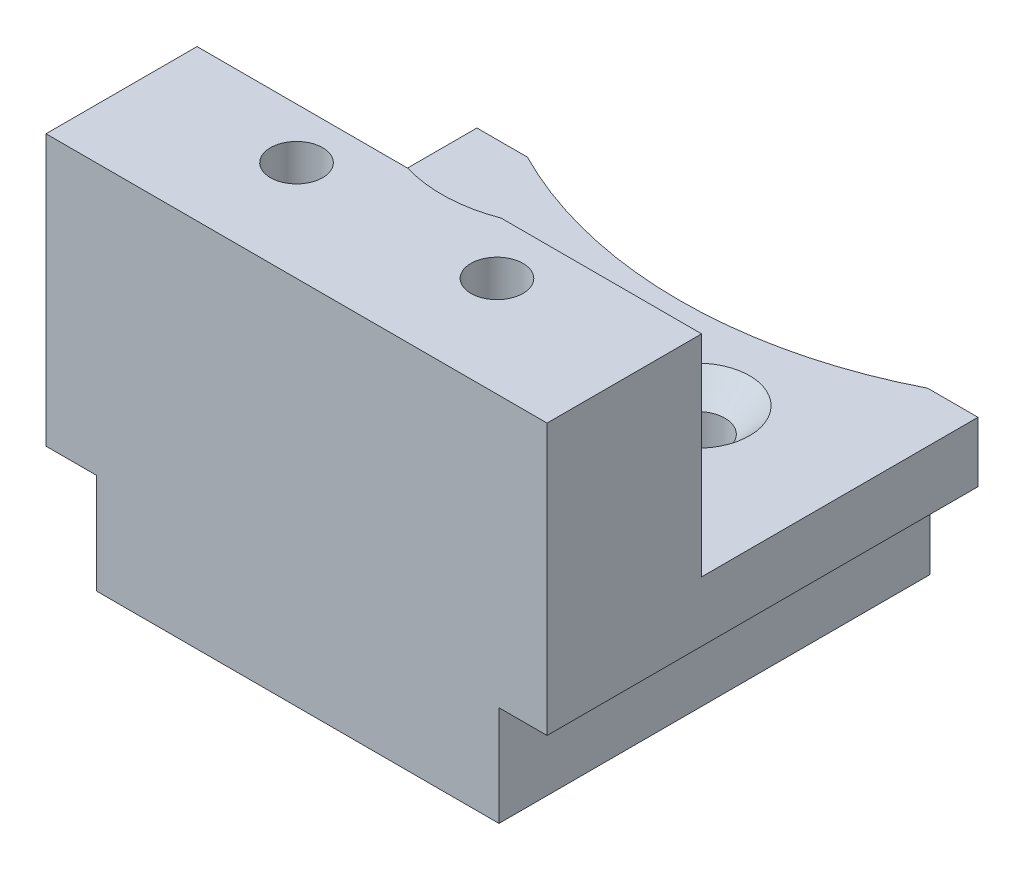
ISO-10303-21;
HEADER;
FILE_DESCRIPTION(('STEP AP214'),'2;1');
FILE_NAME('part.step','',(''),(''),'','','');
FILE_SCHEMA(('AUTOMOTIVE_DESIGN { 1 0 10303 214 1 1 1 1 }'));
ENDSEC;
DATA;
#1=APPLICATION_CONTEXT('core data for automotive mechanical design processes');
#2=APPLICATION_PROTOCOL_DEFINITION('international standard','automotive_design',2000,#1);
#3=PRODUCT_CONTEXT('',#1,'mechanical');
#4=PRODUCT('Part','Part','',(#3));
#5=PRODUCT_RELATED_PRODUCT_CATEGORY('part','',(#4));
#6=PRODUCT_DEFINITION_FORMATION('','',#4);
#7=PRODUCT_DEFINITION_CONTEXT('part definition',#1,'design');
#8=PRODUCT_DEFINITION('design','',#6,#7);
#9=PRODUCT_DEFINITION_SHAPE('','',#8);
#10=(LENGTH_UNIT() NAMED_UNIT(*) SI_UNIT(.MILLI.,.METRE.));
#11=(NAMED_UNIT(*) PLANE_ANGLE_UNIT() SI_UNIT($,.RADIAN.));
#12=(NAMED_UNIT(*) SI_UNIT($,.STERADIAN.) SOLID_ANGLE_UNIT());
#13=UNCERTAINTY_MEASURE_WITH_UNIT(LENGTH_MEASURE(1.E-05),#10,'distance_accuracy_value','');
#14=(GEOMETRIC_REPRESENTATION_CONTEXT(3) GLOBAL_UNCERTAINTY_ASSIGNED_CONTEXT((#13)) GLOBAL_UNIT_ASSIGNED_CONTEXT((#10,
#11,#12)) REPRESENTATION_CONTEXT('',''));
#15=CARTESIAN_POINT('',(0.,0.,0.));
#16=DIRECTION('',(0.,0.,1.));
#17=DIRECTION('',(1.,0.,0.));
#18=AXIS2_PLACEMENT_3D('',#15,#16,#17);
#19=CARTESIAN_POINT('',(0.,6.,3.00000000000003));
#20=DIRECTION('',(0.,0.,-1.));
#21=DIRECTION('',(-1.,0.,0.));
#22=AXIS2_PLACEMENT_3D('',#19,#20,#21);
#23=PLANE('',#22);
#24=DIRECTION('',(1.,0.,0.));
#25=VECTOR('',#24,1.);
#26=CARTESIAN_POINT('',(50.,0.,3.));
#27=LINE('',#26,#25);
#28=CARTESIAN_POINT('',(45.2,0.,3.));
#29=VERTEX_POINT('',#28);
#30=CARTESIAN_POINT('',(50.,0.,3.));
#31=VERTEX_POINT('',#30);
#32=EDGE_CURVE('E153',#29,#31,#27,.T.);
#33=ORIENTED_EDGE('',*,*,#32,.F.);
#34=DIRECTION('',(0.,1.,0.));
#35=VECTOR('',#34,1.);
#36=CARTESIAN_POINT('',(45.2,0.,3.));
#37=LINE('',#36,#35);
#38=CARTESIAN_POINT('',(45.2,-10.,3.));
#39=VERTEX_POINT('',#38);
#40=EDGE_CURVE('E143',#39,#29,#37,.T.);
#41=ORIENTED_EDGE('',*,*,#40,.F.);
#42=DIRECTION('',(-1.,0.,0.));
#43=VECTOR('',#42,1.);
#44=CARTESIAN_POINT('',(50.,-10.,3.));
#45=LINE('',#44,#43);
#46=CARTESIAN_POINT('',(5.03118440875324,-10.,3.00000000000001));
#47=VERTEX_POINT('',#46);
#48=EDGE_CURVE('E151',#39,#47,#45,.T.);
#49=ORIENTED_EDGE('',*,*,#48,.T.);
#50=DIRECTION('',(0.,-1.,0.));
#51=VECTOR('',#50,1.);
#52=CARTESIAN_POINT('',(5.03118440875324,0.,3.00000000000002));
#53=LINE('',#52,#51);
#54=CARTESIAN_POINT('',(5.03118440875324,0.,3.00000000000002));
#55=VERTEX_POINT('',#54);
#56=EDGE_CURVE('E67',#55,#47,#53,.T.);
#57=ORIENTED_EDGE('',*,*,#56,.F.);
#58=DIRECTION('',(-1.,0.,0.));
#59=VECTOR('',#58,1.);
#60=CARTESIAN_POINT('',(50.,0.,2.99999999999999));
#61=LINE('',#60,#59);
#62=CARTESIAN_POINT('',(44.9688155912468,0.,2.99999999999999));
#63=VERTEX_POINT('',#62);
#64=EDGE_CURVE('E161',#63,#55,#61,.T.);
#65=ORIENTED_EDGE('',*,*,#64,.F.);
#66=DIRECTION('',(0.,-1.,0.));
#67=VECTOR('',#66,1.);
#68=CARTESIAN_POINT('',(44.9688155912468,6.,3.));
#69=LINE('',#68,#67);
#70=CARTESIAN_POINT('',(44.9688155912468,6.,3.));
#71=VERTEX_POINT('',#70);
#72=EDGE_CURVE('E285',#71,#63,#69,.T.);
#73=ORIENTED_EDGE('',*,*,#72,.F.);
#74=DIRECTION('',(1.,0.,0.));
#75=VECTOR('',#74,1.);
#76=CARTESIAN_POINT('',(0.,6.,3.00000000000003));
#77=LINE('',#76,#75);
#78=CARTESIAN_POINT('',(50.,6.,3.));
#79=VERTEX_POINT('',#78);
#80=EDGE_CURVE('E281',#71,#79,#77,.T.);
#81=ORIENTED_EDGE('',*,*,#80,.T.);
#82=DIRECTION('',(0.,-1.,0.));
#83=VECTOR('',#82,1.);
#84=CARTESIAN_POINT('',(50.,6.,3.));
#85=LINE('',#84,#83);
#86=EDGE_CURVE('E298',#79,#31,#85,.T.);
#87=ORIENTED_EDGE('',*,*,#86,.T.);
#88=EDGE_LOOP('',(#33,#41,#49,#57,#65,#73,#81,#87));
#89=FACE_BOUND('',#88,.T.);
#90=ADVANCED_FACE('F44',(#89),#23,.T.);
#91=CARTESIAN_POINT('',(0.,6.,0.));
#92=DIRECTION('',(0.,1.,0.));
#93=DIRECTION('',(0.,0.,1.));
#94=AXIS2_PLACEMENT_3D('',#91,#92,#93);
#95=PLANE('',#94);
#96=CARTESIAN_POINT('',(25.,6.,17.5));
#97=DIRECTION('',(0.,1.,0.));
#98=DIRECTION('',(0.,0.,1.));
#99=AXIS2_PLACEMENT_3D('',#96,#97,#98);
#100=CIRCLE('',#99,3.25);
#101=CARTESIAN_POINT('',(25.,6.,20.75));
#102=VERTEX_POINT('',#101);
#103=EDGE_CURVE('E251',#102,#102,#100,.T.);
#104=ORIENTED_EDGE('',*,*,#103,.F.);
#105=EDGE_LOOP('',(#104));
#106=FACE_BOUND('',#105,.T.);
#107=CARTESIAN_POINT('',(35.,6.,16.));
#108=DIRECTION('',(0.,1.,0.));
#109=DIRECTION('',(0.,0.,1.));
#110=AXIS2_PLACEMENT_3D('',#107,#108,#109);
#111=CIRCLE('',#110,5.2);
#112=CARTESIAN_POINT('',(35.,6.,21.2));
#113=VERTEX_POINT('',#112);
#114=EDGE_CURVE('E235',#113,#113,#111,.T.);
#115=ORIENTED_EDGE('',*,*,#114,.F.);
#116=EDGE_LOOP('',(#115));
#117=FACE_BOUND('',#116,.T.);
#118=CARTESIAN_POINT('',(15.,6.,16.));
#119=DIRECTION('',(0.,1.,0.));
#120=DIRECTION('',(0.,0.,1.));
#121=AXIS2_PLACEMENT_3D('',#118,#119,#120);
#122=CIRCLE('',#121,5.2);
#123=CARTESIAN_POINT('',(15.,6.,21.2));
#124=VERTEX_POINT('',#123);
#125=EDGE_CURVE('E223',#124,#124,#122,.T.);
#126=ORIENTED_EDGE('',*,*,#125,.F.);
#127=EDGE_LOOP('',(#126));
#128=FACE_BOUND('',#127,.T.);
#129=CARTESIAN_POINT('',(25.,6.,17.5));
#130=DIRECTION('',(0.,-1.,0.));
#131=DIRECTION('',(0.,0.,1.));
#132=AXIS2_PLACEMENT_3D('',#129,#130,#131);
#133=CIRCLE('',#132,14.);
#134=CARTESIAN_POINT('',(29.9890512919729,6.,30.5808779218393));
#135=VERTEX_POINT('',#134);
#136=CARTESIAN_POINT('',(21.0399484474264,6.,30.9282534866214));
#137=VERTEX_POINT('',#136);
#138=EDGE_CURVE('E204',#135,#137,#133,.T.);
#139=ORIENTED_EDGE('',*,*,#138,.F.);
#140=DIRECTION('',(-1.,0.,0.));
#141=VECTOR('',#140,1.);
#142=CARTESIAN_POINT('',(50.,6.,30.5808779218393));
#143=LINE('',#142,#141);
#144=CARTESIAN_POINT('',(50.,6.,30.5808779218393));
#145=VERTEX_POINT('',#144);
#146=EDGE_CURVE('E179',#145,#135,#143,.T.);
#147=ORIENTED_EDGE('',*,*,#146,.F.);
#148=DIRECTION('',(0.,0.,1.));
#149=VECTOR('',#148,1.);
#150=CARTESIAN_POINT('',(50.,6.,0.));
#151=LINE('',#150,#149);
#152=EDGE_CURVE('E277',#79,#145,#151,.T.);
#153=ORIENTED_EDGE('',*,*,#152,.F.);
#154=ORIENTED_EDGE('',*,*,#80,.F.);
#155=CARTESIAN_POINT('',(25.,6.,-36.2077339804633));
#156=DIRECTION('',(0.,1.,0.));
#157=DIRECTION('',(0.,0.,1.));
#158=AXIS2_PLACEMENT_3D('',#155,#156,#157);
#159=CIRCLE('',#158,44.);
#160=CARTESIAN_POINT('',(5.03118440875324,6.,3.));
#161=VERTEX_POINT('',#160);
#162=EDGE_CURVE('E264',#161,#71,#159,.T.);
#163=ORIENTED_EDGE('',*,*,#162,.F.);
#164=DIRECTION('',(1.,0.,0.));
#165=VECTOR('',#164,1.);
#166=CARTESIAN_POINT('',(0.,6.,3.));
#167=LINE('',#166,#165);
#168=CARTESIAN_POINT('',(0.,6.,3.));
#169=VERTEX_POINT('',#168);
#170=EDGE_CURVE('E268',#169,#161,#167,.T.);
#171=ORIENTED_EDGE('',*,*,#170,.F.);
#172=DIRECTION('',(0.,0.,1.));
#173=VECTOR('',#172,1.);
#174=CARTESIAN_POINT('',(0.,6.,0.));
#175=LINE('',#174,#173);
#176=CARTESIAN_POINT('',(0.,6.,30.9282534866214));
#177=VERTEX_POINT('',#176);
#178=EDGE_CURVE('E273',#169,#177,#175,.T.);
#179=ORIENTED_EDGE('',*,*,#178,.T.);
#180=DIRECTION('',(-1.,0.,0.));
#181=VECTOR('',#180,1.);
#182=CARTESIAN_POINT('',(21.0399484474264,6.,30.9282534866214));
#183=LINE('',#182,#181);
#184=EDGE_CURVE('E185',#137,#177,#183,.T.);
#185=ORIENTED_EDGE('',*,*,#184,.F.);
#186=EDGE_LOOP('',(#139,#147,#153,#154,#163,#171,#179,#185));
#187=FACE_BOUND('',#186,.T.);
#188=ADVANCED_FACE('F390',(#106,#117,#128,#187),#95,.T.);
#189=CARTESIAN_POINT('',(25.,6.,-36.2077339804633));
#190=DIRECTION('',(0.,-1.,0.));
#191=DIRECTION('',(0.,0.,-1.));
#192=AXIS2_PLACEMENT_3D('',#189,#190,#191);
#193=CYLINDRICAL_SURFACE('',#192,44.);
#194=CARTESIAN_POINT('',(25.,0.,-36.2077339804633));
#195=DIRECTION('',(0.,1.,0.));
#196=DIRECTION('',(0.,0.,1.));
#197=AXIS2_PLACEMENT_3D('',#194,#195,#196);
#198=CIRCLE('',#197,44.);
#199=EDGE_CURVE('E260',#55,#63,#198,.T.);
#200=ORIENTED_EDGE('',*,*,#199,.F.);
#201=DIRECTION('',(0.,-1.,0.));
#202=VECTOR('',#201,1.);
#203=CARTESIAN_POINT('',(5.03118440875324,6.,3.));
#204=LINE('',#203,#202);
#205=EDGE_CURVE('E255',#161,#55,#204,.T.);
#206=ORIENTED_EDGE('',*,*,#205,.F.);
#207=ORIENTED_EDGE('',*,*,#162,.T.);
#208=ORIENTED_EDGE('',*,*,#72,.T.);
#209=EDGE_LOOP('',(#200,#206,#207,#208));
#210=FACE_BOUND('',#209,.T.);
#211=ADVANCED_FACE('F46',(#210),#193,.F.);
#212=CARTESIAN_POINT('',(0.,6.,0.));
#213=DIRECTION('',(1.,0.,0.));
#214=DIRECTION('',(0.,0.,-1.));
#215=AXIS2_PLACEMENT_3D('',#212,#213,#214);
#216=PLANE('',#215);
#217=DIRECTION('',(0.,-1.,0.));
#218=VECTOR('',#217,1.);
#219=CARTESIAN_POINT('',(0.,6.,3.));
#220=LINE('',#219,#218);
#221=CARTESIAN_POINT('',(0.,0.,3.00000000000003));
#222=VERTEX_POINT('',#221);
#223=EDGE_CURVE('E309',#169,#222,#220,.T.);
#224=ORIENTED_EDGE('',*,*,#223,.T.);
#225=DIRECTION('',(0.,0.,-1.));
#226=VECTOR('',#225,1.);
#227=CARTESIAN_POINT('',(0.,0.,53.));
#228=LINE('',#227,#226);
#229=CARTESIAN_POINT('',(0.,0.,46.));
#230=VERTEX_POINT('',#229);
#231=EDGE_CURVE('E326',#230,#222,#228,.T.);
#232=ORIENTED_EDGE('',*,*,#231,.F.);
#233=DIRECTION('',(0.,-1.,0.));
#234=VECTOR('',#233,1.);
#235=CARTESIAN_POINT('',(0.,6.,46.));
#236=LINE('',#235,#234);
#237=CARTESIAN_POINT('',(0.,27.,46.));
#238=VERTEX_POINT('',#237);
#239=EDGE_CURVE('E305',#238,#230,#236,.T.);
#240=ORIENTED_EDGE('',*,*,#239,.F.);
#241=DIRECTION('',(0.,0.,1.));
#242=VECTOR('',#241,1.);
#243=CARTESIAN_POINT('',(0.,27.,30.9282534866214));
#244=LINE('',#243,#242);
#245=CARTESIAN_POINT('',(0.,27.,30.9282534866214));
#246=VERTEX_POINT('',#245);
#247=EDGE_CURVE('E180',#246,#238,#244,.T.);
#248=ORIENTED_EDGE('',*,*,#247,.F.);
#249=DIRECTION('',(0.,-1.,0.));
#250=VECTOR('',#249,1.);
#251=CARTESIAN_POINT('',(0.,27.,30.9282534866214));
#252=LINE('',#251,#250);
#253=EDGE_CURVE('E201',#246,#177,#252,.T.);
#254=ORIENTED_EDGE('',*,*,#253,.T.);
#255=ORIENTED_EDGE('',*,*,#178,.F.);
#256=EDGE_LOOP('',(#224,#232,#240,#248,#254,#255));
#257=FACE_BOUND('',#256,.T.);
#258=ADVANCED_FACE('F365',(#257),#216,.F.);
#259=CARTESIAN_POINT('',(0.,6.,46.));
#260=DIRECTION('',(0.,0.,-1.));
#261=DIRECTION('',(-1.,0.,0.));
#262=AXIS2_PLACEMENT_3D('',#259,#260,#261);
#263=PLANE('',#262);
#264=DIRECTION('',(0.,1.,0.));
#265=VECTOR('',#264,1.);
#266=CARTESIAN_POINT('',(45.2,6.,46.));
#267=LINE('',#266,#265);
#268=CARTESIAN_POINT('',(45.2,-10.,46.));
#269=VERTEX_POINT('',#268);
#270=CARTESIAN_POINT('',(45.2,0.,46.));
#271=VERTEX_POINT('',#270);
#272=EDGE_CURVE('E59',#269,#271,#267,.T.);
#273=ORIENTED_EDGE('',*,*,#272,.T.);
#274=DIRECTION('',(1.,0.,0.));
#275=VECTOR('',#274,1.);
#276=CARTESIAN_POINT('',(0.,0.,46.));
#277=LINE('',#276,#275);
#278=CARTESIAN_POINT('',(50.,0.,46.));
#279=VERTEX_POINT('',#278);
#280=EDGE_CURVE('E168',#271,#279,#277,.T.);
#281=ORIENTED_EDGE('',*,*,#280,.T.);
#282=DIRECTION('',(0.,-1.,0.));
#283=VECTOR('',#282,1.);
#284=CARTESIAN_POINT('',(50.,6.,46.));
#285=LINE('',#284,#283);
#286=CARTESIAN_POINT('',(50.,27.,46.));
#287=VERTEX_POINT('',#286);
#288=EDGE_CURVE('E301',#287,#279,#285,.T.);
#289=ORIENTED_EDGE('',*,*,#288,.F.);
#290=DIRECTION('',(1.,0.,0.));
#291=VECTOR('',#290,1.);
#292=CARTESIAN_POINT('',(0.,27.,46.));
#293=LINE('',#292,#291);
#294=EDGE_CURVE('E184',#238,#287,#293,.T.);
#295=ORIENTED_EDGE('',*,*,#294,.F.);
#296=ORIENTED_EDGE('',*,*,#239,.T.);
#297=DIRECTION('',(1.,0.,0.));
#298=VECTOR('',#297,1.);
#299=CARTESIAN_POINT('',(0.,0.,46.));
#300=LINE('',#299,#298);
#301=CARTESIAN_POINT('',(5.03118440875326,0.,46.));
#302=VERTEX_POINT('',#301);
#303=EDGE_CURVE('E343',#230,#302,#300,.T.);
#304=ORIENTED_EDGE('',*,*,#303,.T.);
#305=DIRECTION('',(0.,-1.,0.));
#306=VECTOR('',#305,1.);
#307=CARTESIAN_POINT('',(5.03118440875326,6.,46.));
#308=LINE('',#307,#306);
#309=CARTESIAN_POINT('',(5.03118440875326,-10.,46.));
#310=VERTEX_POINT('',#309);
#311=EDGE_CURVE('E336',#302,#310,#308,.T.);
#312=ORIENTED_EDGE('',*,*,#311,.T.);
#313=DIRECTION('',(-1.,0.,0.));
#314=VECTOR('',#313,1.);
#315=CARTESIAN_POINT('',(50.,-10.,46.));
#316=LINE('',#315,#314);
#317=EDGE_CURVE('E160',#269,#310,#316,.T.);
#318=ORIENTED_EDGE('',*,*,#317,.F.);
#319=EDGE_LOOP('',(#273,#281,#289,#295,#296,#304,#312,#318));
#320=FACE_BOUND('',#319,.T.);
#321=ADVANCED_FACE('F349',(#320),#263,.F.);
#322=CARTESIAN_POINT('',(50.,6.,0.));
#323=DIRECTION('',(1.,0.,0.));
#324=DIRECTION('',(0.,0.,-1.));
#325=AXIS2_PLACEMENT_3D('',#322,#323,#324);
#326=PLANE('',#325);
#327=DIRECTION('',(0.,0.,-1.));
#328=VECTOR('',#327,1.);
#329=CARTESIAN_POINT('',(50.,0.,53.));
#330=LINE('',#329,#328);
#331=EDGE_CURVE('E340',#279,#31,#330,.T.);
#332=ORIENTED_EDGE('',*,*,#331,.T.);
#333=ORIENTED_EDGE('',*,*,#86,.F.);
#334=ORIENTED_EDGE('',*,*,#152,.T.);
#335=DIRECTION('',(0.,-1.,0.));
#336=VECTOR('',#335,1.);
#337=CARTESIAN_POINT('',(50.,27.,30.5808779218393));
#338=LINE('',#337,#336);
#339=CARTESIAN_POINT('',(50.,27.,30.5808779218393));
#340=VERTEX_POINT('',#339);
#341=EDGE_CURVE('E220',#340,#145,#338,.T.);
#342=ORIENTED_EDGE('',*,*,#341,.F.);
#343=DIRECTION('',(0.,0.,-1.));
#344=VECTOR('',#343,1.);
#345=CARTESIAN_POINT('',(50.,27.,46.));
#346=LINE('',#345,#344);
#347=EDGE_CURVE('E189',#287,#340,#346,.T.);
#348=ORIENTED_EDGE('',*,*,#347,.F.);
#349=ORIENTED_EDGE('',*,*,#288,.T.);
#350=EDGE_LOOP('',(#332,#333,#334,#342,#348,#349));
#351=FACE_BOUND('',#350,.T.);
#352=ADVANCED_FACE('F355',(#351),#326,.T.);
#353=CARTESIAN_POINT('',(35.,6.,36.));
#354=DIRECTION('',(0.,-1.,0.));
#355=DIRECTION('',(0.,0.,-1.));
#356=AXIS2_PLACEMENT_3D('',#353,#354,#355);
#357=CYLINDRICAL_SURFACE('',#356,2.6);
#358=CARTESIAN_POINT('',(35.,0.,36.));
#359=DIRECTION('',(0.,1.,0.));
#360=DIRECTION('',(0.,0.,1.));
#361=AXIS2_PLACEMENT_3D('',#358,#359,#360);
#362=CIRCLE('',#361,2.6);
#363=CARTESIAN_POINT('',(35.,0.,38.6));
#364=VERTEX_POINT('',#363);
#365=EDGE_CURVE('E269',#364,#364,#362,.T.);
#366=ORIENTED_EDGE('',*,*,#365,.F.);
#367=EDGE_LOOP('',(#366));
#368=FACE_BOUND('',#367,.T.);
#369=CARTESIAN_POINT('',(35.,27.,36.));
#370=DIRECTION('',(0.,1.,0.));
#371=DIRECTION('',(0.,0.,1.));
#372=AXIS2_PLACEMENT_3D('',#369,#370,#371);
#373=CIRCLE('',#372,2.6);
#374=CARTESIAN_POINT('',(35.,27.,38.6));
#375=VERTEX_POINT('',#374);
#376=EDGE_CURVE('E165',#375,#375,#373,.T.);
#377=ORIENTED_EDGE('',*,*,#376,.T.);
#378=EDGE_LOOP('',(#377));
#379=FACE_BOUND('',#378,.T.);
#380=ADVANCED_FACE('F413',(#368,#379),#357,.F.);
#381=CARTESIAN_POINT('',(15.,6.,36.));
#382=DIRECTION('',(0.,-1.,0.));
#383=DIRECTION('',(0.,0.,-1.));
#384=AXIS2_PLACEMENT_3D('',#381,#382,#383);
#385=CYLINDRICAL_SURFACE('',#384,2.6);
#386=CARTESIAN_POINT('',(15.,0.,36.));
#387=DIRECTION('',(0.,1.,0.));
#388=DIRECTION('',(0.,0.,1.));
#389=AXIS2_PLACEMENT_3D('',#386,#387,#388);
#390=CIRCLE('',#389,2.6);
#391=CARTESIAN_POINT('',(15.,0.,38.6));
#392=VERTEX_POINT('',#391);
#393=EDGE_CURVE('E289',#392,#392,#390,.T.);
#394=ORIENTED_EDGE('',*,*,#393,.F.);
#395=EDGE_LOOP('',(#394));
#396=FACE_BOUND('',#395,.T.);
#397=CARTESIAN_POINT('',(15.,27.,36.));
#398=DIRECTION('',(0.,1.,0.));
#399=DIRECTION('',(0.,0.,1.));
#400=AXIS2_PLACEMENT_3D('',#397,#398,#399);
#401=CIRCLE('',#400,2.6);
#402=CARTESIAN_POINT('',(15.,27.,38.6));
#403=VERTEX_POINT('',#402);
#404=EDGE_CURVE('E175',#403,#403,#401,.T.);
#405=ORIENTED_EDGE('',*,*,#404,.T.);
#406=EDGE_LOOP('',(#405));
#407=FACE_BOUND('',#406,.T.);
#408=ADVANCED_FACE('F403',(#396,#407),#385,.F.);
#409=DIRECTION('',(1.,0.,0.));
#410=VECTOR('',#409,1.);
#411=CARTESIAN_POINT('',(0.,0.,3.00000000000003));
#412=LINE('',#411,#410);
#413=EDGE_CURVE('E155',#222,#55,#412,.T.);
#414=ORIENTED_EDGE('',*,*,#413,.F.);
#415=ORIENTED_EDGE('',*,*,#223,.F.);
#416=ORIENTED_EDGE('',*,*,#170,.T.);
#417=ORIENTED_EDGE('',*,*,#205,.T.);
#418=EDGE_LOOP('',(#414,#415,#416,#417));
#419=FACE_BOUND('',#418,.T.);
#420=ADVANCED_FACE('F317',(#419),#23,.T.);
#421=CARTESIAN_POINT('',(25.,8.,17.5));
#422=DIRECTION('',(0.,-1.,0.));
#423=DIRECTION('',(0.,0.,-1.));
#424=AXIS2_PLACEMENT_3D('',#421,#422,#423);
#425=CYLINDRICAL_SURFACE('',#424,3.25);
#426=CARTESIAN_POINT('',(25.,8.,17.5));
#427=DIRECTION('',(0.,1.,0.));
#428=DIRECTION('',(0.,0.,1.));
#429=AXIS2_PLACEMENT_3D('',#426,#427,#428);
#430=CIRCLE('',#429,3.25);
#431=CARTESIAN_POINT('',(25.,8.,20.75));
#432=VERTEX_POINT('',#431);
#433=EDGE_CURVE('E256',#432,#432,#430,.T.);
#434=ORIENTED_EDGE('',*,*,#433,.F.);
#435=EDGE_LOOP('',(#434));
#436=FACE_BOUND('',#435,.T.);
#437=ORIENTED_EDGE('',*,*,#103,.T.);
#438=EDGE_LOOP('',(#437));
#439=FACE_BOUND('',#438,.T.);
#440=ADVANCED_FACE('F402',(#436,#439),#425,.T.);
#441=CARTESIAN_POINT('',(25.,8.,17.5));
#442=DIRECTION('',(0.,1.,0.));
#443=DIRECTION('',(0.,0.,1.));
#444=AXIS2_PLACEMENT_3D('',#441,#442,#443);
#445=PLANE('',#444);
#446=CARTESIAN_POINT('',(25.,8.,17.5));
#447=DIRECTION('',(0.,1.,0.));
#448=DIRECTION('',(0.,0.,1.));
#449=AXIS2_PLACEMENT_3D('',#446,#447,#448);
#450=CIRCLE('',#449,2.5);
#451=CARTESIAN_POINT('',(25.,8.,15.));
#452=VERTEX_POINT('',#451);
#453=EDGE_CURVE('E53',#452,#452,#450,.T.);
#454=ORIENTED_EDGE('',*,*,#453,.F.);
#455=EDGE_LOOP('',(#454));
#456=FACE_BOUND('',#455,.T.);
#457=ORIENTED_EDGE('',*,*,#433,.T.);
#458=EDGE_LOOP('',(#457));
#459=FACE_BOUND('',#458,.T.);
#460=ADVANCED_FACE('F409',(#456,#459),#445,.T.);
#461=CARTESIAN_POINT('',(25.,10.7,17.5));
#462=DIRECTION('',(0.,-1.,0.));
#463=DIRECTION('',(0.,0.,-1.));
#464=AXIS2_PLACEMENT_3D('',#461,#462,#463);
#465=CYLINDRICAL_SURFACE('',#464,2.5);
#466=CARTESIAN_POINT('',(25.,10.7,17.5));
#467=DIRECTION('',(0.,1.,0.));
#468=DIRECTION('',(0.,0.,1.));
#469=AXIS2_PLACEMENT_3D('',#466,#467,#468);
#470=CIRCLE('',#469,2.5);
#471=CARTESIAN_POINT('',(25.,10.7,15.));
#472=VERTEX_POINT('',#471);
#473=EDGE_CURVE('E247',#472,#472,#470,.T.);
#474=CARTESIAN_POINT('',(25.,10.7,15.));
#475=CARTESIAN_POINT('',(25.,10.671875,15.));
#476=CARTESIAN_POINT('',(25.,10.64375,15.));
#477=CARTESIAN_POINT('',(25.,10.5875,15.));
#478=CARTESIAN_POINT('',(25.,10.559375,15.));
#479=CARTESIAN_POINT('',(25.,10.503125,15.));
#480=CARTESIAN_POINT('',(25.,10.475,15.));
#481=CARTESIAN_POINT('',(25.,10.41875,15.));
#482=CARTESIAN_POINT('',(25.,10.390625,15.));
#483=CARTESIAN_POINT('',(25.,10.334375,15.));
#484=CARTESIAN_POINT('',(25.,10.30625,15.));
#485=CARTESIAN_POINT('',(25.,10.25,15.));
#486=CARTESIAN_POINT('',(25.,10.221875,15.));
#487=CARTESIAN_POINT('',(25.,10.165625,15.));
#488=CARTESIAN_POINT('',(25.,10.1375,15.));
#489=CARTESIAN_POINT('',(25.,10.08125,15.));
#490=CARTESIAN_POINT('',(25.,10.053125,15.));
#491=CARTESIAN_POINT('',(25.,9.996875,15.));
#492=CARTESIAN_POINT('',(25.,9.96875,15.));
#493=CARTESIAN_POINT('',(25.,9.9125,15.));
#494=CARTESIAN_POINT('',(25.,9.884375,15.));
#495=CARTESIAN_POINT('',(25.,9.828125,15.));
#496=CARTESIAN_POINT('',(25.,9.8,15.));
#497=CARTESIAN_POINT('',(25.,9.74375,15.));
#498=CARTESIAN_POINT('',(25.,9.715625,15.));
#499=CARTESIAN_POINT('',(25.,9.659375,15.));
#500=CARTESIAN_POINT('',(25.,9.63125,15.));
#501=CARTESIAN_POINT('',(25.,9.575,15.));
#502=CARTESIAN_POINT('',(25.,9.546875,15.));
#503=CARTESIAN_POINT('',(25.,9.490625,15.));
#504=CARTESIAN_POINT('',(25.,9.4625,15.));
#505=CARTESIAN_POINT('',(25.,9.40625,15.));
#506=CARTESIAN_POINT('',(25.,9.378125,15.));
#507=CARTESIAN_POINT('',(25.,9.321875,15.));
#508=CARTESIAN_POINT('',(25.,9.29375,15.));
#509=CARTESIAN_POINT('',(25.,9.2375,15.));
#510=CARTESIAN_POINT('',(25.,9.209375,15.));
#511=CARTESIAN_POINT('',(25.,9.153125,15.));
#512=CARTESIAN_POINT('',(25.,9.125,15.));
#513=CARTESIAN_POINT('',(25.,9.06875,15.));
#514=CARTESIAN_POINT('',(25.,9.040625,15.));
#515=CARTESIAN_POINT('',(25.,8.984375,15.));
#516=CARTESIAN_POINT('',(25.,8.95625,15.));
#517=CARTESIAN_POINT('',(25.,8.9,15.));
#518=CARTESIAN_POINT('',(25.,8.871875,15.));
#519=CARTESIAN_POINT('',(25.,8.815625,15.));
#520=CARTESIAN_POINT('',(25.,8.7875,15.));
#521=CARTESIAN_POINT('',(25.,8.73125,15.));
#522=CARTESIAN_POINT('',(25.,8.703125,15.));
#523=CARTESIAN_POINT('',(25.,8.646875,15.));
#524=CARTESIAN_POINT('',(25.,8.61875,15.));
#525=CARTESIAN_POINT('',(25.,8.5625,15.));
#526=CARTESIAN_POINT('',(25.,8.534375,15.));
#527=CARTESIAN_POINT('',(25.,8.478125,15.));
#528=CARTESIAN_POINT('',(25.,8.45,15.));
#529=CARTESIAN_POINT('',(25.,8.39375,15.));
#530=CARTESIAN_POINT('',(25.,8.365625,15.));
#531=CARTESIAN_POINT('',(25.,8.309375,15.));
#532=CARTESIAN_POINT('',(25.,8.28125,15.));
#533=CARTESIAN_POINT('',(25.,8.225,15.));
#534=CARTESIAN_POINT('',(25.,8.196875,15.));
#535=CARTESIAN_POINT('',(25.,8.140625,15.));
#536=CARTESIAN_POINT('',(25.,8.1125,15.));
#537=CARTESIAN_POINT('',(25.,8.05625,15.));
#538=CARTESIAN_POINT('',(25.,8.028125,15.));
#539=CARTESIAN_POINT('',(25.,8.,15.));
#540=B_SPLINE_CURVE_WITH_KNOTS('',3,(#474,#475,#476,#477,#478,#479,#480,#481,#482,#483,#484,
#485,#486,#487,#488,#489,#490,#491,#492,#493,#494,#495,#496,#497,#498,#499,#500,#501,#502,#503,
#504,#505,#506,#507,#508,#509,#510,#511,#512,#513,#514,#515,#516,#517,#518,#519,#520,#521,#522,
#523,#524,#525,#526,#527,#528,#529,#530,#531,#532,#533,#534,#535,#536,#537,#538,#539),
.UNSPECIFIED.,.F.,.F.,(4,2,2,2,2,2,2,2,2,2,2,2,2,2,2,2,2,2,2,2,2,2,2,2,2,2,2,2,2,2,2,2,4),(0.,
0.0843749999999994,0.168749999999999,0.253125,0.337499999999999,0.421874999999999,0.50625,
0.590624999999999,0.675,0.759375,0.843749999999999,0.928125,1.0125,1.096875,1.18125,1.265625,
1.35,1.434375,1.51875,1.603125,1.6875,1.771875,1.85625,1.940625,2.025,2.109375,2.19375,2.278125,
2.3625,2.446875,2.53125,2.615625,2.7),.UNSPECIFIED.);
#541=EDGE_CURVE('BSEAM425',#472,#452,#540,.T.);
#542=ORIENTED_EDGE('',*,*,#473,.F.);
#543=ORIENTED_EDGE('',*,*,#453,.T.);
#544=ORIENTED_EDGE('',*,*,#541,.T.);
#545=ORIENTED_EDGE('',*,*,#541,.F.);
#546=EDGE_LOOP('',(#542,#544,#543,#545));
#547=FACE_BOUND('',#546,.T.);
#548=ADVANCED_FACE('F425',(#547),#465,.T.);
#549=CARTESIAN_POINT('',(25.,10.7,17.5));
#550=DIRECTION('',(0.,1.,0.));
#551=DIRECTION('',(0.,0.,1.));
#552=AXIS2_PLACEMENT_3D('',#549,#550,#551);
#553=PLANE('',#552);
#554=ORIENTED_EDGE('',*,*,#473,.T.);
#555=EDGE_LOOP('',(#554));
#556=FACE_BOUND('',#555,.T.);
#557=ADVANCED_FACE('F429',(#556),#553,.T.);
#558=CARTESIAN_POINT('',(35.,6.,16.));
#559=DIRECTION('',(0.,1.,0.));
#560=DIRECTION('',(0.,0.,1.));
#561=AXIS2_PLACEMENT_3D('',#558,#559,#560);
#562=CYLINDRICAL_SURFACE('',#561,2.75);
#563=CARTESIAN_POINT('',(35.,0.,16.));
#564=DIRECTION('',(0.,1.,0.));
#565=DIRECTION('',(0.,0.,1.));
#566=AXIS2_PLACEMENT_3D('',#563,#564,#565);
#567=CIRCLE('',#566,2.75);
#568=CARTESIAN_POINT('',(35.,0.,18.75));
#569=VERTEX_POINT('',#568);
#570=EDGE_CURVE('E243',#569,#569,#567,.T.);
#571=ORIENTED_EDGE('',*,*,#570,.F.);
#572=EDGE_LOOP('',(#571));
#573=FACE_BOUND('',#572,.T.);
#574=CARTESIAN_POINT('',(35.,3.55,16.));
#575=DIRECTION('',(0.,1.,0.));
#576=DIRECTION('',(0.,0.,1.));
#577=AXIS2_PLACEMENT_3D('',#574,#575,#576);
#578=CIRCLE('',#577,2.75);
#579=CARTESIAN_POINT('',(35.,3.55,18.75));
#580=VERTEX_POINT('',#579);
#581=EDGE_CURVE('E239',#580,#580,#578,.T.);
#582=ORIENTED_EDGE('',*,*,#581,.T.);
#583=EDGE_LOOP('',(#582));
#584=FACE_BOUND('',#583,.T.);
#585=ADVANCED_FACE('F433',(#573,#584),#562,.F.);
#586=CARTESIAN_POINT('',(35.,6.,16.));
#587=DIRECTION('',(0.,1.,0.));
#588=DIRECTION('',(0.,0.,1.));
#589=AXIS2_PLACEMENT_3D('',#586,#587,#588);
#590=CONICAL_SURFACE('',#589,5.2,0.785398163397449);
#591=ORIENTED_EDGE('',*,*,#581,.F.);
#592=EDGE_LOOP('',(#591));
#593=FACE_BOUND('',#592,.T.);
#594=ORIENTED_EDGE('',*,*,#114,.T.);
#595=EDGE_LOOP('',(#594));
#596=FACE_BOUND('',#595,.T.);
#597=ADVANCED_FACE('F437',(#593,#596),#590,.F.);
#598=CARTESIAN_POINT('',(15.,6.,16.));
#599=DIRECTION('',(0.,1.,0.));
#600=DIRECTION('',(0.,0.,1.));
#601=AXIS2_PLACEMENT_3D('',#598,#599,#600);
#602=CYLINDRICAL_SURFACE('',#601,2.75);
#603=CARTESIAN_POINT('',(15.,0.,16.));
#604=DIRECTION('',(0.,1.,0.));
#605=DIRECTION('',(0.,0.,1.));
#606=AXIS2_PLACEMENT_3D('',#603,#604,#605);
#607=CIRCLE('',#606,2.75);
#608=CARTESIAN_POINT('',(15.,0.,18.75));
#609=VERTEX_POINT('',#608);
#610=EDGE_CURVE('E231',#609,#609,#607,.T.);
#611=ORIENTED_EDGE('',*,*,#610,.F.);
#612=EDGE_LOOP('',(#611));
#613=FACE_BOUND('',#612,.T.);
#614=CARTESIAN_POINT('',(15.,3.55,16.));
#615=DIRECTION('',(0.,1.,0.));
#616=DIRECTION('',(0.,0.,1.));
#617=AXIS2_PLACEMENT_3D('',#614,#615,#616);
#618=CIRCLE('',#617,2.75);
#619=CARTESIAN_POINT('',(15.,3.55,18.75));
#620=VERTEX_POINT('',#619);
#621=EDGE_CURVE('E227',#620,#620,#618,.T.);
#622=ORIENTED_EDGE('',*,*,#621,.T.);
#623=EDGE_LOOP('',(#622));
#624=FACE_BOUND('',#623,.T.);
#625=ADVANCED_FACE('F441',(#613,#624),#602,.F.);
#626=CARTESIAN_POINT('',(15.,6.,16.));
#627=DIRECTION('',(0.,1.,0.));
#628=DIRECTION('',(0.,0.,1.));
#629=AXIS2_PLACEMENT_3D('',#626,#627,#628);
#630=CONICAL_SURFACE('',#629,5.2,0.785398163397449);
#631=ORIENTED_EDGE('',*,*,#621,.F.);
#632=EDGE_LOOP('',(#631));
#633=FACE_BOUND('',#632,.T.);
#634=ORIENTED_EDGE('',*,*,#125,.T.);
#635=EDGE_LOOP('',(#634));
#636=FACE_BOUND('',#635,.T.);
#637=ADVANCED_FACE('F445',(#633,#636),#630,.F.);
#638=CARTESIAN_POINT('',(25.,27.,17.5));
#639=DIRECTION('',(0.,1.,0.));
#640=DIRECTION('',(0.,0.,1.));
#641=AXIS2_PLACEMENT_3D('',#638,#639,#640);
#642=PLANE('',#641);
#643=ORIENTED_EDGE('',*,*,#404,.F.);
#644=EDGE_LOOP('',(#643));
#645=FACE_BOUND('',#644,.T.);
#646=ORIENTED_EDGE('',*,*,#247,.T.);
#647=ORIENTED_EDGE('',*,*,#294,.T.);
#648=ORIENTED_EDGE('',*,*,#347,.T.);
#649=DIRECTION('',(-1.,0.,0.));
#650=VECTOR('',#649,1.);
#651=CARTESIAN_POINT('',(50.,27.,30.5808779218393));
#652=LINE('',#651,#650);
#653=CARTESIAN_POINT('',(29.9890512919729,27.,30.5808779218393));
#654=VERTEX_POINT('',#653);
#655=EDGE_CURVE('E192',#340,#654,#652,.T.);
#656=ORIENTED_EDGE('',*,*,#655,.T.);
#657=CARTESIAN_POINT('',(25.,27.,17.5));
#658=DIRECTION('',(0.,-1.,0.));
#659=DIRECTION('',(0.,0.,1.));
#660=AXIS2_PLACEMENT_3D('',#657,#658,#659);
#661=CIRCLE('',#660,14.);
#662=CARTESIAN_POINT('',(21.0399484474264,27.,30.9282534866214));
#663=VERTEX_POINT('',#662);
#664=EDGE_CURVE('E195',#654,#663,#661,.T.);
#665=ORIENTED_EDGE('',*,*,#664,.T.);
#666=DIRECTION('',(-1.,0.,0.));
#667=VECTOR('',#666,1.);
#668=CARTESIAN_POINT('',(21.0399484474264,27.,30.9282534866214));
#669=LINE('',#668,#667);
#670=EDGE_CURVE('E198',#663,#246,#669,.T.);
#671=ORIENTED_EDGE('',*,*,#670,.T.);
#672=EDGE_LOOP('',(#646,#647,#648,#656,#665,#671));
#673=FACE_BOUND('',#672,.T.);
#674=ORIENTED_EDGE('',*,*,#376,.F.);
#675=EDGE_LOOP('',(#674));
#676=FACE_BOUND('',#675,.T.);
#677=ADVANCED_FACE('F359',(#645,#673,#676),#642,.T.);
#678=CARTESIAN_POINT('',(50.,27.,30.5808779218393));
#679=DIRECTION('',(0.,0.,1.));
#680=DIRECTION('',(1.,0.,0.));
#681=AXIS2_PLACEMENT_3D('',#678,#679,#680);
#682=PLANE('',#681);
#683=ORIENTED_EDGE('',*,*,#146,.T.);
#684=DIRECTION('',(0.,-1.,0.));
#685=VECTOR('',#684,1.);
#686=CARTESIAN_POINT('',(29.9890512919729,27.,30.5808779218393));
#687=LINE('',#686,#685);
#688=EDGE_CURVE('E216',#654,#135,#687,.T.);
#689=ORIENTED_EDGE('',*,*,#688,.F.);
#690=ORIENTED_EDGE('',*,*,#655,.F.);
#691=ORIENTED_EDGE('',*,*,#341,.T.);
#692=EDGE_LOOP('',(#683,#689,#690,#691));
#693=FACE_BOUND('',#692,.T.);
#694=ADVANCED_FACE('F450',(#693),#682,.F.);
#695=CARTESIAN_POINT('',(25.,27.,17.5));
#696=DIRECTION('',(0.,-1.,0.));
#697=DIRECTION('',(0.,0.,-1.));
#698=AXIS2_PLACEMENT_3D('',#695,#696,#697);
#699=CYLINDRICAL_SURFACE('',#698,14.);
#700=ORIENTED_EDGE('',*,*,#138,.T.);
#701=DIRECTION('',(0.,-1.,0.));
#702=VECTOR('',#701,1.);
#703=CARTESIAN_POINT('',(21.0399484474264,27.,30.9282534866214));
#704=LINE('',#703,#702);
#705=EDGE_CURVE('E213',#663,#137,#704,.T.);
#706=ORIENTED_EDGE('',*,*,#705,.F.);
#707=ORIENTED_EDGE('',*,*,#664,.F.);
#708=ORIENTED_EDGE('',*,*,#688,.T.);
#709=EDGE_LOOP('',(#700,#706,#707,#708));
#710=FACE_BOUND('',#709,.T.);
#711=ADVANCED_FACE('F453',(#710),#699,.F.);
#712=CARTESIAN_POINT('',(21.0399484474264,27.,30.9282534866214));
#713=DIRECTION('',(0.,0.,1.));
#714=DIRECTION('',(1.,0.,0.));
#715=AXIS2_PLACEMENT_3D('',#712,#713,#714);
#716=PLANE('',#715);
#717=ORIENTED_EDGE('',*,*,#184,.T.);
#718=ORIENTED_EDGE('',*,*,#253,.F.);
#719=ORIENTED_EDGE('',*,*,#670,.F.);
#720=ORIENTED_EDGE('',*,*,#705,.T.);
#721=EDGE_LOOP('',(#717,#718,#719,#720));
#722=FACE_BOUND('',#721,.T.);
#723=ADVANCED_FACE('F457',(#722),#716,.F.);
#724=CARTESIAN_POINT('',(50.,0.,2.99999999999999));
#725=DIRECTION('',(0.,1.,0.));
#726=DIRECTION('',(0.,0.,1.));
#727=AXIS2_PLACEMENT_3D('',#724,#725,#726);
#728=PLANE('',#727);
#729=ORIENTED_EDGE('',*,*,#365,.T.);
#730=EDGE_LOOP('',(#729));
#731=FACE_BOUND('',#730,.T.);
#732=ADVANCED_FACE('F461',(#731),#728,.T.);
#733=ORIENTED_EDGE('',*,*,#393,.T.);
#734=EDGE_LOOP('',(#733));
#735=FACE_BOUND('',#734,.T.);
#736=ADVANCED_FACE('F471',(#735),#728,.T.);
#737=CARTESIAN_POINT('',(50.,-10.,46.));
#738=DIRECTION('',(0.,-1.,0.));
#739=DIRECTION('',(0.,0.,-1.));
#740=AXIS2_PLACEMENT_3D('',#737,#738,#739);
#741=PLANE('',#740);
#742=DIRECTION('',(0.,0.,-1.));
#743=VECTOR('',#742,1.);
#744=CARTESIAN_POINT('',(45.2,-10.,46.));
#745=LINE('',#744,#743);
#746=EDGE_CURVE('E11',#269,#39,#745,.T.);
#747=ORIENTED_EDGE('',*,*,#746,.F.);
#748=ORIENTED_EDGE('',*,*,#317,.T.);
#749=DIRECTION('',(0.,0.,-1.));
#750=VECTOR('',#749,1.);
#751=CARTESIAN_POINT('',(5.03118440875327,-10.,53.));
#752=LINE('',#751,#750);
#753=EDGE_CURVE('E158',#310,#47,#752,.T.);
#754=ORIENTED_EDGE('',*,*,#753,.T.);
#755=ORIENTED_EDGE('',*,*,#48,.F.);
#756=EDGE_LOOP('',(#747,#748,#754,#755));
#757=FACE_BOUND('',#756,.T.);
#758=ADVANCED_FACE('F157',(#757),#741,.T.);
#759=ORIENTED_EDGE('',*,*,#64,.T.);
#760=ORIENTED_EDGE('',*,*,#199,.T.);
#761=EDGE_LOOP('',(#759,#760));
#762=FACE_BOUND('',#761,.T.);
#763=ADVANCED_FACE('F324',(#762),#728,.T.);
#764=ORIENTED_EDGE('',*,*,#570,.T.);
#765=EDGE_LOOP('',(#764));
#766=FACE_BOUND('',#765,.T.);
#767=ADVANCED_FACE('F469',(#766),#728,.T.);
#768=ORIENTED_EDGE('',*,*,#610,.T.);
#769=EDGE_LOOP('',(#768));
#770=FACE_BOUND('',#769,.T.);
#771=ADVANCED_FACE('F466',(#770),#728,.T.);
#772=CARTESIAN_POINT('',(0.,0.,53.));
#773=DIRECTION('',(0.,1.,0.));
#774=DIRECTION('',(0.,0.,1.));
#775=AXIS2_PLACEMENT_3D('',#772,#773,#774);
#776=PLANE('',#775);
#777=ORIENTED_EDGE('',*,*,#231,.T.);
#778=ORIENTED_EDGE('',*,*,#413,.T.);
#779=DIRECTION('',(0.,0.,-1.));
#780=VECTOR('',#779,1.);
#781=CARTESIAN_POINT('',(5.03118440875327,0.,53.));
#782=LINE('',#781,#780);
#783=EDGE_CURVE('E331',#302,#55,#782,.T.);
#784=ORIENTED_EDGE('',*,*,#783,.F.);
#785=ORIENTED_EDGE('',*,*,#303,.F.);
#786=EDGE_LOOP('',(#777,#778,#784,#785));
#787=FACE_BOUND('',#786,.T.);
#788=ADVANCED_FACE('F368',(#787),#776,.F.);
#789=CARTESIAN_POINT('',(5.03118440875327,0.,53.));
#790=DIRECTION('',(1.,0.,0.));
#791=DIRECTION('',(0.,0.,-1.));
#792=AXIS2_PLACEMENT_3D('',#789,#790,#791);
#793=PLANE('',#792);
#794=ORIENTED_EDGE('',*,*,#783,.T.);
#795=ORIENTED_EDGE('',*,*,#56,.T.);
#796=ORIENTED_EDGE('',*,*,#753,.F.);
#797=ORIENTED_EDGE('',*,*,#311,.F.);
#798=EDGE_LOOP('',(#794,#795,#796,#797));
#799=FACE_BOUND('',#798,.T.);
#800=ADVANCED_FACE('F381',(#799),#793,.F.);
#801=CARTESIAN_POINT('',(50.,0.,53.));
#802=DIRECTION('',(0.,1.,0.));
#803=DIRECTION('',(0.,0.,1.));
#804=AXIS2_PLACEMENT_3D('',#801,#802,#803);
#805=PLANE('',#804);
#806=DIRECTION('',(0.,0.,-1.));
#807=VECTOR('',#806,1.);
#808=CARTESIAN_POINT('',(45.2,0.,53.));
#809=LINE('',#808,#807);
#810=EDGE_CURVE('E373',#271,#29,#809,.T.);
#811=ORIENTED_EDGE('',*,*,#810,.T.);
#812=ORIENTED_EDGE('',*,*,#32,.T.);
#813=ORIENTED_EDGE('',*,*,#331,.F.);
#814=ORIENTED_EDGE('',*,*,#280,.F.);
#815=EDGE_LOOP('',(#811,#812,#813,#814));
#816=FACE_BOUND('',#815,.T.);
#817=ADVANCED_FACE('F379',(#816),#805,.F.);
#818=CARTESIAN_POINT('',(45.2,0.,53.));
#819=DIRECTION('',(-1.,0.,0.));
#820=DIRECTION('',(0.,0.,1.));
#821=AXIS2_PLACEMENT_3D('',#818,#819,#820);
#822=PLANE('',#821);
#823=ORIENTED_EDGE('',*,*,#746,.T.);
#824=ORIENTED_EDGE('',*,*,#40,.T.);
#825=ORIENTED_EDGE('',*,*,#810,.F.);
#826=ORIENTED_EDGE('',*,*,#272,.F.);
#827=EDGE_LOOP('',(#823,#824,#825,#826));
#828=FACE_BOUND('',#827,.T.);
#829=ADVANCED_FACE('F142',(#828),#822,.F.);
#830=CLOSED_SHELL('',(#90,#188,#211,#258,#321,#352,#380,#408,#420,#440,#460,#548,#557,#585,#597,
#625,#637,#677,#694,#711,#723,#732,#736,#758,#763,#767,#771,#788,#800,#817,#829));
#831=MANIFOLD_SOLID_BREP('B2',#830);
#832=ADVANCED_BREP_SHAPE_REPRESENTATION('',(#18,#831),#14);
#833=SHAPE_DEFINITION_REPRESENTATION(#9,#832);
ENDSEC;
END-ISO-10303-21;
